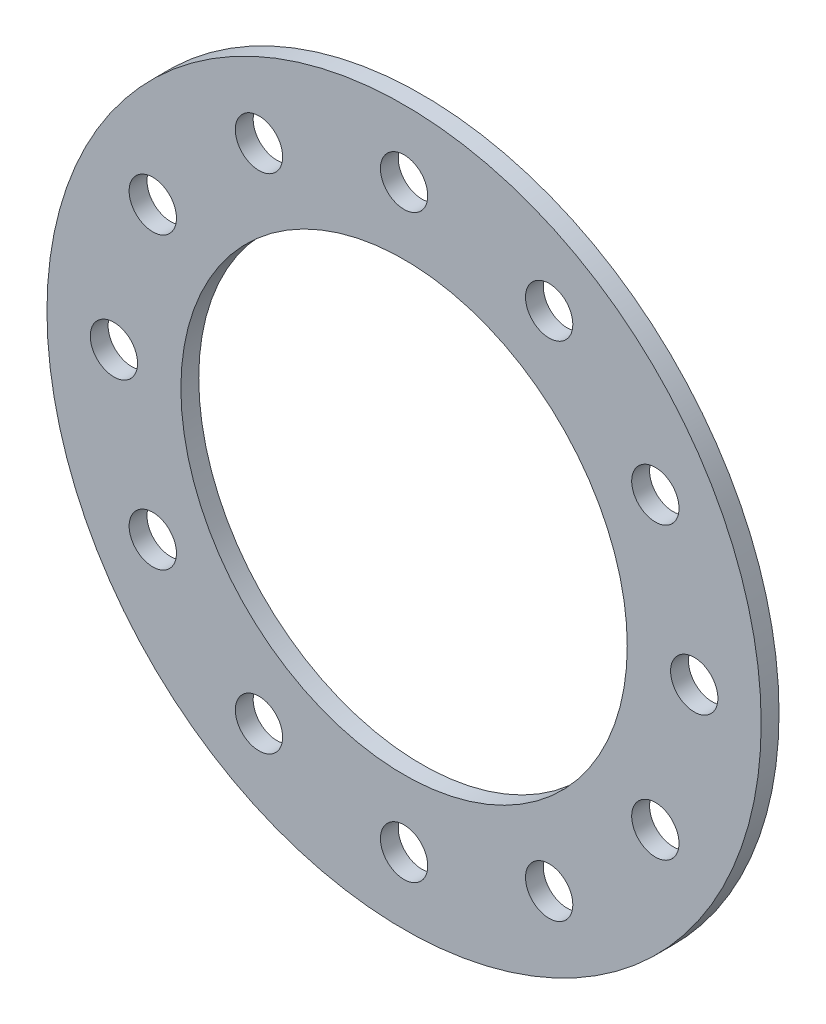
ISO-10303-21;
HEADER;
FILE_DESCRIPTION(('STEP AP214'),'2;1');
FILE_NAME('part.step','',(''),(''),'','','');
FILE_SCHEMA(('AUTOMOTIVE_DESIGN { 1 0 10303 214 1 1 1 1 }'));
ENDSEC;
DATA;
#1=APPLICATION_CONTEXT('core data for automotive mechanical design processes');
#2=APPLICATION_PROTOCOL_DEFINITION('international standard','automotive_design',2000,#1);
#3=PRODUCT_CONTEXT('',#1,'mechanical');
#4=PRODUCT('Part','Part','',(#3));
#5=PRODUCT_RELATED_PRODUCT_CATEGORY('part','',(#4));
#6=PRODUCT_DEFINITION_FORMATION('','',#4);
#7=PRODUCT_DEFINITION_CONTEXT('part definition',#1,'design');
#8=PRODUCT_DEFINITION('design','',#6,#7);
#9=PRODUCT_DEFINITION_SHAPE('','',#8);
#10=(LENGTH_UNIT() NAMED_UNIT(*) SI_UNIT(.MILLI.,.METRE.));
#11=(NAMED_UNIT(*) PLANE_ANGLE_UNIT() SI_UNIT($,.RADIAN.));
#12=(NAMED_UNIT(*) SI_UNIT($,.STERADIAN.) SOLID_ANGLE_UNIT());
#13=UNCERTAINTY_MEASURE_WITH_UNIT(LENGTH_MEASURE(1.E-05),#10,'distance_accuracy_value','');
#14=(GEOMETRIC_REPRESENTATION_CONTEXT(3) GLOBAL_UNCERTAINTY_ASSIGNED_CONTEXT((#13)) GLOBAL_UNIT_ASSIGNED_CONTEXT((#10,
#11,#12)) REPRESENTATION_CONTEXT('',''));
#15=CARTESIAN_POINT('',(0.,0.,0.));
#16=DIRECTION('',(0.,0.,1.));
#17=DIRECTION('',(1.,0.,0.));
#18=AXIS2_PLACEMENT_3D('',#15,#16,#17);
#19=CARTESIAN_POINT('',(0.,0.,2.));
#20=DIRECTION('',(0.,0.,1.));
#21=DIRECTION('',(1.,0.,0.));
#22=AXIS2_PLACEMENT_3D('',#19,#20,#21);
#23=PLANE('',#22);
#24=CARTESIAN_POINT('',(16.2499999999996,28.1458256229945,2.));
#25=DIRECTION('',(0.,0.,1.));
#26=DIRECTION('',(1.,0.,0.));
#27=AXIS2_PLACEMENT_3D('',#24,#25,#26);
#28=CIRCLE('',#27,2.65);
#29=CARTESIAN_POINT('',(18.8999999999996,28.1458256229945,2.));
#30=VERTEX_POINT('',#29);
#31=EDGE_CURVE('E119',#30,#30,#28,.T.);
#32=ORIENTED_EDGE('',*,*,#31,.F.);
#33=EDGE_LOOP('',(#32));
#34=FACE_BOUND('',#33,.T.);
#35=CARTESIAN_POINT('',(28.1458256229941,16.2500000000003,2.));
#36=DIRECTION('',(0.,0.,1.));
#37=DIRECTION('',(1.,0.,0.));
#38=AXIS2_PLACEMENT_3D('',#35,#36,#37);
#39=CIRCLE('',#38,2.65);
#40=CARTESIAN_POINT('',(30.7958256229941,16.2500000000003,2.));
#41=VERTEX_POINT('',#40);
#42=EDGE_CURVE('E113',#41,#41,#39,.T.);
#43=ORIENTED_EDGE('',*,*,#42,.F.);
#44=EDGE_LOOP('',(#43));
#45=FACE_BOUND('',#44,.T.);
#46=CARTESIAN_POINT('',(32.5,3.40419430537206E-13,2.));
#47=DIRECTION('',(0.,0.,1.));
#48=DIRECTION('',(1.,0.,0.));
#49=AXIS2_PLACEMENT_3D('',#46,#47,#48);
#50=CIRCLE('',#49,2.65);
#51=CARTESIAN_POINT('',(35.15,3.40419430537206E-13,2.));
#52=VERTEX_POINT('',#51);
#53=EDGE_CURVE('E107',#52,#52,#50,.T.);
#54=ORIENTED_EDGE('',*,*,#53,.F.);
#55=EDGE_LOOP('',(#54));
#56=FACE_BOUND('',#55,.T.);
#57=CARTESIAN_POINT('',(28.1458256229944,-16.2499999999997,2.));
#58=DIRECTION('',(0.,0.,1.));
#59=DIRECTION('',(1.,0.,0.));
#60=AXIS2_PLACEMENT_3D('',#57,#58,#59);
#61=CIRCLE('',#60,2.65);
#62=CARTESIAN_POINT('',(30.7958256229944,-16.2499999999997,2.));
#63=VERTEX_POINT('',#62);
#64=EDGE_CURVE('E101',#63,#63,#61,.T.);
#65=ORIENTED_EDGE('',*,*,#64,.F.);
#66=EDGE_LOOP('',(#65));
#67=FACE_BOUND('',#66,.T.);
#68=CARTESIAN_POINT('',(16.2500000000002,-28.1458256229941,2.));
#69=DIRECTION('',(0.,0.,1.));
#70=DIRECTION('',(1.,0.,0.));
#71=AXIS2_PLACEMENT_3D('',#68,#69,#70);
#72=CIRCLE('',#71,2.65);
#73=CARTESIAN_POINT('',(18.9000000000002,-28.1458256229941,2.));
#74=VERTEX_POINT('',#73);
#75=EDGE_CURVE('E95',#74,#74,#72,.T.);
#76=ORIENTED_EDGE('',*,*,#75,.F.);
#77=EDGE_LOOP('',(#76));
#78=FACE_BOUND('',#77,.T.);
#79=CARTESIAN_POINT('',(0.,-32.5,2.));
#80=DIRECTION('',(0.,0.,1.));
#81=DIRECTION('',(1.,0.,0.));
#82=AXIS2_PLACEMENT_3D('',#79,#80,#81);
#83=CIRCLE('',#82,2.65);
#84=CARTESIAN_POINT('',(2.65,-32.5,2.));
#85=VERTEX_POINT('',#84);
#86=EDGE_CURVE('E89',#85,#85,#83,.T.);
#87=ORIENTED_EDGE('',*,*,#86,.F.);
#88=EDGE_LOOP('',(#87));
#89=FACE_BOUND('',#88,.T.);
#90=CARTESIAN_POINT('',(-16.2499999999998,-28.1458256229944,2.));
#91=DIRECTION('',(0.,0.,1.));
#92=DIRECTION('',(1.,0.,0.));
#93=AXIS2_PLACEMENT_3D('',#90,#91,#92);
#94=CIRCLE('',#93,2.65);
#95=CARTESIAN_POINT('',(-13.5999999999998,-28.1458256229944,2.));
#96=VERTEX_POINT('',#95);
#97=EDGE_CURVE('E83',#96,#96,#94,.T.);
#98=ORIENTED_EDGE('',*,*,#97,.F.);
#99=EDGE_LOOP('',(#98));
#100=FACE_BOUND('',#99,.T.);
#101=CARTESIAN_POINT('',(-28.1458256229942,-16.2500000000001,2.));
#102=DIRECTION('',(0.,0.,1.));
#103=DIRECTION('',(1.,0.,0.));
#104=AXIS2_PLACEMENT_3D('',#101,#102,#103);
#105=CIRCLE('',#104,2.65);
#106=CARTESIAN_POINT('',(-25.4958256229942,-16.2500000000001,2.));
#107=VERTEX_POINT('',#106);
#108=EDGE_CURVE('E77',#107,#107,#105,.T.);
#109=ORIENTED_EDGE('',*,*,#108,.F.);
#110=EDGE_LOOP('',(#109));
#111=FACE_BOUND('',#110,.T.);
#112=CARTESIAN_POINT('',(-32.5,-1.13473143512402E-13,2.));
#113=DIRECTION('',(0.,0.,1.));
#114=DIRECTION('',(1.,0.,0.));
#115=AXIS2_PLACEMENT_3D('',#112,#113,#114);
#116=CIRCLE('',#115,2.65);
#117=CARTESIAN_POINT('',(-29.85,-1.13473143512402E-13,2.));
#118=VERTEX_POINT('',#117);
#119=EDGE_CURVE('E71',#118,#118,#116,.T.);
#120=ORIENTED_EDGE('',*,*,#119,.F.);
#121=EDGE_LOOP('',(#120));
#122=FACE_BOUND('',#121,.T.);
#123=CARTESIAN_POINT('',(-28.1458256229943,16.2499999999999,2.));
#124=DIRECTION('',(0.,0.,1.));
#125=DIRECTION('',(1.,0.,0.));
#126=AXIS2_PLACEMENT_3D('',#123,#124,#125);
#127=CIRCLE('',#126,2.65);
#128=CARTESIAN_POINT('',(-25.4958256229943,16.2499999999999,2.));
#129=VERTEX_POINT('',#128);
#130=EDGE_CURVE('E65',#129,#129,#127,.T.);
#131=ORIENTED_EDGE('',*,*,#130,.F.);
#132=EDGE_LOOP('',(#131));
#133=FACE_BOUND('',#132,.T.);
#134=CARTESIAN_POINT('',(-16.25,28.1458256229942,2.));
#135=DIRECTION('',(0.,0.,1.));
#136=DIRECTION('',(1.,0.,0.));
#137=AXIS2_PLACEMENT_3D('',#134,#135,#136);
#138=CIRCLE('',#137,2.65);
#139=CARTESIAN_POINT('',(-13.6,28.1458256229942,2.));
#140=VERTEX_POINT('',#139);
#141=EDGE_CURVE('E59',#140,#140,#138,.T.);
#142=ORIENTED_EDGE('',*,*,#141,.F.);
#143=EDGE_LOOP('',(#142));
#144=FACE_BOUND('',#143,.T.);
#145=CARTESIAN_POINT('',(0.,32.5,2.));
#146=DIRECTION('',(0.,0.,1.));
#147=DIRECTION('',(1.,0.,0.));
#148=AXIS2_PLACEMENT_3D('',#145,#146,#147);
#149=CIRCLE('',#148,2.65);
#150=CARTESIAN_POINT('',(2.65,32.5,2.));
#151=VERTEX_POINT('',#150);
#152=EDGE_CURVE('E53',#151,#151,#149,.T.);
#153=ORIENTED_EDGE('',*,*,#152,.F.);
#154=EDGE_LOOP('',(#153));
#155=FACE_BOUND('',#154,.T.);
#156=CARTESIAN_POINT('',(0.,0.,2.));
#157=DIRECTION('',(0.,0.,1.));
#158=DIRECTION('',(1.,0.,0.));
#159=AXIS2_PLACEMENT_3D('',#156,#157,#158);
#160=CIRCLE('',#159,40.);
#161=CARTESIAN_POINT('',(40.,0.,2.));
#162=VERTEX_POINT('',#161);
#163=EDGE_CURVE('E10',#162,#162,#160,.T.);
#164=ORIENTED_EDGE('',*,*,#163,.T.);
#165=EDGE_LOOP('',(#164));
#166=FACE_BOUND('',#165,.T.);
#167=CARTESIAN_POINT('',(0.,0.,2.));
#168=DIRECTION('',(0.,0.,1.));
#169=DIRECTION('',(1.,0.,0.));
#170=AXIS2_PLACEMENT_3D('',#167,#168,#169);
#171=CIRCLE('',#170,25.);
#172=CARTESIAN_POINT('',(25.,0.,2.));
#173=VERTEX_POINT('',#172);
#174=EDGE_CURVE('E43',#173,#173,#171,.T.);
#175=ORIENTED_EDGE('',*,*,#174,.F.);
#176=EDGE_LOOP('',(#175));
#177=FACE_BOUND('',#176,.T.);
#178=ADVANCED_FACE('F32',(#34,#45,#56,#67,#78,#89,#100,#111,#122,#133,#144,#155,#166,#177),#23,.T.);
#179=CARTESIAN_POINT('',(0.,0.,0.));
#180=DIRECTION('',(0.,0.,1.));
#181=DIRECTION('',(1.,0.,0.));
#182=AXIS2_PLACEMENT_3D('',#179,#180,#181);
#183=PLANE('',#182);
#184=CARTESIAN_POINT('',(16.2499999999996,28.1458256229945,0.));
#185=DIRECTION('',(0.,0.,1.));
#186=DIRECTION('',(1.,0.,0.));
#187=AXIS2_PLACEMENT_3D('',#184,#185,#186);
#188=CIRCLE('',#187,2.65);
#189=CARTESIAN_POINT('',(18.8999999999996,28.1458256229945,0.));
#190=VERTEX_POINT('',#189);
#191=EDGE_CURVE('E116',#190,#190,#188,.T.);
#192=ORIENTED_EDGE('',*,*,#191,.T.);
#193=EDGE_LOOP('',(#192));
#194=FACE_BOUND('',#193,.T.);
#195=CARTESIAN_POINT('',(28.1458256229941,16.2500000000003,0.));
#196=DIRECTION('',(0.,0.,1.));
#197=DIRECTION('',(1.,0.,0.));
#198=AXIS2_PLACEMENT_3D('',#195,#196,#197);
#199=CIRCLE('',#198,2.65);
#200=CARTESIAN_POINT('',(30.7958256229941,16.2500000000003,0.));
#201=VERTEX_POINT('',#200);
#202=EDGE_CURVE('E110',#201,#201,#199,.T.);
#203=ORIENTED_EDGE('',*,*,#202,.T.);
#204=EDGE_LOOP('',(#203));
#205=FACE_BOUND('',#204,.T.);
#206=CARTESIAN_POINT('',(32.5,3.40419430537206E-13,0.));
#207=DIRECTION('',(0.,0.,1.));
#208=DIRECTION('',(1.,0.,0.));
#209=AXIS2_PLACEMENT_3D('',#206,#207,#208);
#210=CIRCLE('',#209,2.65);
#211=CARTESIAN_POINT('',(35.15,3.40419430537206E-13,0.));
#212=VERTEX_POINT('',#211);
#213=EDGE_CURVE('E104',#212,#212,#210,.T.);
#214=ORIENTED_EDGE('',*,*,#213,.T.);
#215=EDGE_LOOP('',(#214));
#216=FACE_BOUND('',#215,.T.);
#217=CARTESIAN_POINT('',(28.1458256229944,-16.2499999999997,0.));
#218=DIRECTION('',(0.,0.,1.));
#219=DIRECTION('',(1.,0.,0.));
#220=AXIS2_PLACEMENT_3D('',#217,#218,#219);
#221=CIRCLE('',#220,2.65);
#222=CARTESIAN_POINT('',(30.7958256229944,-16.2499999999997,0.));
#223=VERTEX_POINT('',#222);
#224=EDGE_CURVE('E98',#223,#223,#221,.T.);
#225=ORIENTED_EDGE('',*,*,#224,.T.);
#226=EDGE_LOOP('',(#225));
#227=FACE_BOUND('',#226,.T.);
#228=CARTESIAN_POINT('',(16.2500000000002,-28.1458256229941,0.));
#229=DIRECTION('',(0.,0.,1.));
#230=DIRECTION('',(1.,0.,0.));
#231=AXIS2_PLACEMENT_3D('',#228,#229,#230);
#232=CIRCLE('',#231,2.65);
#233=CARTESIAN_POINT('',(18.9000000000002,-28.1458256229941,0.));
#234=VERTEX_POINT('',#233);
#235=EDGE_CURVE('E92',#234,#234,#232,.T.);
#236=ORIENTED_EDGE('',*,*,#235,.T.);
#237=EDGE_LOOP('',(#236));
#238=FACE_BOUND('',#237,.T.);
#239=CARTESIAN_POINT('',(0.,-32.5,0.));
#240=DIRECTION('',(0.,0.,1.));
#241=DIRECTION('',(1.,0.,0.));
#242=AXIS2_PLACEMENT_3D('',#239,#240,#241);
#243=CIRCLE('',#242,2.65);
#244=CARTESIAN_POINT('',(2.65,-32.5,0.));
#245=VERTEX_POINT('',#244);
#246=EDGE_CURVE('E86',#245,#245,#243,.T.);
#247=ORIENTED_EDGE('',*,*,#246,.T.);
#248=EDGE_LOOP('',(#247));
#249=FACE_BOUND('',#248,.T.);
#250=CARTESIAN_POINT('',(-16.2499999999998,-28.1458256229944,0.));
#251=DIRECTION('',(0.,0.,1.));
#252=DIRECTION('',(1.,0.,0.));
#253=AXIS2_PLACEMENT_3D('',#250,#251,#252);
#254=CIRCLE('',#253,2.65);
#255=CARTESIAN_POINT('',(-13.5999999999998,-28.1458256229944,0.));
#256=VERTEX_POINT('',#255);
#257=EDGE_CURVE('E80',#256,#256,#254,.T.);
#258=ORIENTED_EDGE('',*,*,#257,.T.);
#259=EDGE_LOOP('',(#258));
#260=FACE_BOUND('',#259,.T.);
#261=CARTESIAN_POINT('',(-28.1458256229942,-16.2500000000001,0.));
#262=DIRECTION('',(0.,0.,1.));
#263=DIRECTION('',(1.,0.,0.));
#264=AXIS2_PLACEMENT_3D('',#261,#262,#263);
#265=CIRCLE('',#264,2.65);
#266=CARTESIAN_POINT('',(-25.4958256229942,-16.2500000000001,0.));
#267=VERTEX_POINT('',#266);
#268=EDGE_CURVE('E74',#267,#267,#265,.T.);
#269=ORIENTED_EDGE('',*,*,#268,.T.);
#270=EDGE_LOOP('',(#269));
#271=FACE_BOUND('',#270,.T.);
#272=CARTESIAN_POINT('',(-32.5,-1.13473143512402E-13,0.));
#273=DIRECTION('',(0.,0.,1.));
#274=DIRECTION('',(1.,0.,0.));
#275=AXIS2_PLACEMENT_3D('',#272,#273,#274);
#276=CIRCLE('',#275,2.65);
#277=CARTESIAN_POINT('',(-29.85,-1.13473143512402E-13,0.));
#278=VERTEX_POINT('',#277);
#279=EDGE_CURVE('E68',#278,#278,#276,.T.);
#280=ORIENTED_EDGE('',*,*,#279,.T.);
#281=EDGE_LOOP('',(#280));
#282=FACE_BOUND('',#281,.T.);
#283=CARTESIAN_POINT('',(-28.1458256229943,16.2499999999999,0.));
#284=DIRECTION('',(0.,0.,1.));
#285=DIRECTION('',(1.,0.,0.));
#286=AXIS2_PLACEMENT_3D('',#283,#284,#285);
#287=CIRCLE('',#286,2.65);
#288=CARTESIAN_POINT('',(-25.4958256229943,16.2499999999999,0.));
#289=VERTEX_POINT('',#288);
#290=EDGE_CURVE('E62',#289,#289,#287,.T.);
#291=ORIENTED_EDGE('',*,*,#290,.T.);
#292=EDGE_LOOP('',(#291));
#293=FACE_BOUND('',#292,.T.);
#294=CARTESIAN_POINT('',(-16.25,28.1458256229942,0.));
#295=DIRECTION('',(0.,0.,1.));
#296=DIRECTION('',(1.,0.,0.));
#297=AXIS2_PLACEMENT_3D('',#294,#295,#296);
#298=CIRCLE('',#297,2.65);
#299=CARTESIAN_POINT('',(-13.6,28.1458256229942,0.));
#300=VERTEX_POINT('',#299);
#301=EDGE_CURVE('E56',#300,#300,#298,.T.);
#302=ORIENTED_EDGE('',*,*,#301,.T.);
#303=EDGE_LOOP('',(#302));
#304=FACE_BOUND('',#303,.T.);
#305=CARTESIAN_POINT('',(0.,32.5,0.));
#306=DIRECTION('',(0.,0.,1.));
#307=DIRECTION('',(1.,0.,0.));
#308=AXIS2_PLACEMENT_3D('',#305,#306,#307);
#309=CIRCLE('',#308,2.65);
#310=CARTESIAN_POINT('',(2.65,32.5,0.));
#311=VERTEX_POINT('',#310);
#312=EDGE_CURVE('E48',#311,#311,#309,.T.);
#313=ORIENTED_EDGE('',*,*,#312,.T.);
#314=EDGE_LOOP('',(#313));
#315=FACE_BOUND('',#314,.T.);
#316=CARTESIAN_POINT('',(0.,0.,0.));
#317=DIRECTION('',(0.,0.,1.));
#318=DIRECTION('',(1.,0.,0.));
#319=AXIS2_PLACEMENT_3D('',#316,#317,#318);
#320=CIRCLE('',#319,40.);
#321=CARTESIAN_POINT('',(40.,0.,0.));
#322=VERTEX_POINT('',#321);
#323=EDGE_CURVE('E36',#322,#322,#320,.T.);
#324=ORIENTED_EDGE('',*,*,#323,.F.);
#325=EDGE_LOOP('',(#324));
#326=FACE_BOUND('',#325,.T.);
#327=CARTESIAN_POINT('',(0.,0.,0.));
#328=DIRECTION('',(0.,0.,1.));
#329=DIRECTION('',(1.,0.,0.));
#330=AXIS2_PLACEMENT_3D('',#327,#328,#329);
#331=CIRCLE('',#330,25.);
#332=CARTESIAN_POINT('',(25.,0.,0.));
#333=VERTEX_POINT('',#332);
#334=EDGE_CURVE('E45',#333,#333,#331,.T.);
#335=ORIENTED_EDGE('',*,*,#334,.T.);
#336=EDGE_LOOP('',(#335));
#337=FACE_BOUND('',#336,.T.);
#338=ADVANCED_FACE('F127',(#194,#205,#216,#227,#238,#249,#260,#271,#282,#293,#304,#315,#326,
#337),#183,.F.);
#339=CARTESIAN_POINT('',(0.,0.,2.));
#340=DIRECTION('',(0.,0.,-1.));
#341=DIRECTION('',(-1.,0.,0.));
#342=AXIS2_PLACEMENT_3D('',#339,#340,#341);
#343=CYLINDRICAL_SURFACE('',#342,40.);
#344=ORIENTED_EDGE('',*,*,#163,.F.);
#345=EDGE_LOOP('',(#344));
#346=FACE_BOUND('',#345,.T.);
#347=ORIENTED_EDGE('',*,*,#323,.T.);
#348=EDGE_LOOP('',(#347));
#349=FACE_BOUND('',#348,.T.);
#350=ADVANCED_FACE('F34',(#346,#349),#343,.T.);
#351=CARTESIAN_POINT('',(0.,0.,2.));
#352=DIRECTION('',(0.,0.,-1.));
#353=DIRECTION('',(-1.,0.,0.));
#354=AXIS2_PLACEMENT_3D('',#351,#352,#353);
#355=CYLINDRICAL_SURFACE('',#354,25.);
#356=ORIENTED_EDGE('',*,*,#174,.T.);
#357=EDGE_LOOP('',(#356));
#358=FACE_BOUND('',#357,.T.);
#359=ORIENTED_EDGE('',*,*,#334,.F.);
#360=EDGE_LOOP('',(#359));
#361=FACE_BOUND('',#360,.T.);
#362=ADVANCED_FACE('F153',(#358,#361),#355,.F.);
#363=CARTESIAN_POINT('',(0.,32.5,2.));
#364=DIRECTION('',(0.,0.,1.));
#365=DIRECTION('',(1.,0.,0.));
#366=AXIS2_PLACEMENT_3D('',#363,#364,#365);
#367=CYLINDRICAL_SURFACE('',#366,2.65);
#368=ORIENTED_EDGE('',*,*,#312,.F.);
#369=EDGE_LOOP('',(#368));
#370=FACE_BOUND('',#369,.T.);
#371=ORIENTED_EDGE('',*,*,#152,.T.);
#372=EDGE_LOOP('',(#371));
#373=FACE_BOUND('',#372,.T.);
#374=ADVANCED_FACE('F156',(#370,#373),#367,.F.);
#375=CARTESIAN_POINT('',(-16.25,28.1458256229942,2.));
#376=DIRECTION('',(0.,0.,1.));
#377=DIRECTION('',(1.,0.,0.));
#378=AXIS2_PLACEMENT_3D('',#375,#376,#377);
#379=CYLINDRICAL_SURFACE('',#378,2.65);
#380=ORIENTED_EDGE('',*,*,#301,.F.);
#381=EDGE_LOOP('',(#380));
#382=FACE_BOUND('',#381,.T.);
#383=ORIENTED_EDGE('',*,*,#141,.T.);
#384=EDGE_LOOP('',(#383));
#385=FACE_BOUND('',#384,.T.);
#386=ADVANCED_FACE('F170',(#382,#385),#379,.F.);
#387=CARTESIAN_POINT('',(-28.1458256229943,16.2499999999999,2.));
#388=DIRECTION('',(0.,0.,1.));
#389=DIRECTION('',(1.,0.,0.));
#390=AXIS2_PLACEMENT_3D('',#387,#388,#389);
#391=CYLINDRICAL_SURFACE('',#390,2.65);
#392=ORIENTED_EDGE('',*,*,#290,.F.);
#393=EDGE_LOOP('',(#392));
#394=FACE_BOUND('',#393,.T.);
#395=ORIENTED_EDGE('',*,*,#130,.T.);
#396=EDGE_LOOP('',(#395));
#397=FACE_BOUND('',#396,.T.);
#398=ADVANCED_FACE('F174',(#394,#397),#391,.F.);
#399=CARTESIAN_POINT('',(-32.5,-1.13473143512402E-13,2.));
#400=DIRECTION('',(0.,0.,1.));
#401=DIRECTION('',(1.,0.,0.));
#402=AXIS2_PLACEMENT_3D('',#399,#400,#401);
#403=CYLINDRICAL_SURFACE('',#402,2.65);
#404=ORIENTED_EDGE('',*,*,#279,.F.);
#405=EDGE_LOOP('',(#404));
#406=FACE_BOUND('',#405,.T.);
#407=ORIENTED_EDGE('',*,*,#119,.T.);
#408=EDGE_LOOP('',(#407));
#409=FACE_BOUND('',#408,.T.);
#410=ADVANCED_FACE('F178',(#406,#409),#403,.F.);
#411=CARTESIAN_POINT('',(-28.1458256229942,-16.2500000000001,2.));
#412=DIRECTION('',(0.,0.,1.));
#413=DIRECTION('',(1.,0.,0.));
#414=AXIS2_PLACEMENT_3D('',#411,#412,#413);
#415=CYLINDRICAL_SURFACE('',#414,2.65);
#416=ORIENTED_EDGE('',*,*,#268,.F.);
#417=EDGE_LOOP('',(#416));
#418=FACE_BOUND('',#417,.T.);
#419=ORIENTED_EDGE('',*,*,#108,.T.);
#420=EDGE_LOOP('',(#419));
#421=FACE_BOUND('',#420,.T.);
#422=ADVANCED_FACE('F182',(#418,#421),#415,.F.);
#423=CARTESIAN_POINT('',(-16.2499999999998,-28.1458256229944,2.));
#424=DIRECTION('',(0.,0.,1.));
#425=DIRECTION('',(1.,0.,0.));
#426=AXIS2_PLACEMENT_3D('',#423,#424,#425);
#427=CYLINDRICAL_SURFACE('',#426,2.65);
#428=ORIENTED_EDGE('',*,*,#257,.F.);
#429=EDGE_LOOP('',(#428));
#430=FACE_BOUND('',#429,.T.);
#431=ORIENTED_EDGE('',*,*,#97,.T.);
#432=EDGE_LOOP('',(#431));
#433=FACE_BOUND('',#432,.T.);
#434=ADVANCED_FACE('F186',(#430,#433),#427,.F.);
#435=CARTESIAN_POINT('',(0.,-32.5,2.));
#436=DIRECTION('',(0.,0.,1.));
#437=DIRECTION('',(1.,0.,0.));
#438=AXIS2_PLACEMENT_3D('',#435,#436,#437);
#439=CYLINDRICAL_SURFACE('',#438,2.65);
#440=ORIENTED_EDGE('',*,*,#246,.F.);
#441=EDGE_LOOP('',(#440));
#442=FACE_BOUND('',#441,.T.);
#443=ORIENTED_EDGE('',*,*,#86,.T.);
#444=EDGE_LOOP('',(#443));
#445=FACE_BOUND('',#444,.T.);
#446=ADVANCED_FACE('F190',(#442,#445),#439,.F.);
#447=CARTESIAN_POINT('',(16.2500000000002,-28.1458256229941,2.));
#448=DIRECTION('',(0.,0.,1.));
#449=DIRECTION('',(1.,0.,0.));
#450=AXIS2_PLACEMENT_3D('',#447,#448,#449);
#451=CYLINDRICAL_SURFACE('',#450,2.65);
#452=ORIENTED_EDGE('',*,*,#235,.F.);
#453=EDGE_LOOP('',(#452));
#454=FACE_BOUND('',#453,.T.);
#455=ORIENTED_EDGE('',*,*,#75,.T.);
#456=EDGE_LOOP('',(#455));
#457=FACE_BOUND('',#456,.T.);
#458=ADVANCED_FACE('F194',(#454,#457),#451,.F.);
#459=CARTESIAN_POINT('',(28.1458256229944,-16.2499999999997,2.));
#460=DIRECTION('',(0.,0.,1.));
#461=DIRECTION('',(1.,0.,0.));
#462=AXIS2_PLACEMENT_3D('',#459,#460,#461);
#463=CYLINDRICAL_SURFACE('',#462,2.65);
#464=ORIENTED_EDGE('',*,*,#224,.F.);
#465=EDGE_LOOP('',(#464));
#466=FACE_BOUND('',#465,.T.);
#467=ORIENTED_EDGE('',*,*,#64,.T.);
#468=EDGE_LOOP('',(#467));
#469=FACE_BOUND('',#468,.T.);
#470=ADVANCED_FACE('F198',(#466,#469),#463,.F.);
#471=CARTESIAN_POINT('',(32.5,3.40419430537206E-13,2.));
#472=DIRECTION('',(0.,0.,1.));
#473=DIRECTION('',(1.,0.,0.));
#474=AXIS2_PLACEMENT_3D('',#471,#472,#473);
#475=CYLINDRICAL_SURFACE('',#474,2.65);
#476=ORIENTED_EDGE('',*,*,#213,.F.);
#477=EDGE_LOOP('',(#476));
#478=FACE_BOUND('',#477,.T.);
#479=ORIENTED_EDGE('',*,*,#53,.T.);
#480=EDGE_LOOP('',(#479));
#481=FACE_BOUND('',#480,.T.);
#482=ADVANCED_FACE('F202',(#478,#481),#475,.F.);
#483=CARTESIAN_POINT('',(28.1458256229941,16.2500000000003,2.));
#484=DIRECTION('',(0.,0.,1.));
#485=DIRECTION('',(1.,0.,0.));
#486=AXIS2_PLACEMENT_3D('',#483,#484,#485);
#487=CYLINDRICAL_SURFACE('',#486,2.65);
#488=ORIENTED_EDGE('',*,*,#202,.F.);
#489=EDGE_LOOP('',(#488));
#490=FACE_BOUND('',#489,.T.);
#491=ORIENTED_EDGE('',*,*,#42,.T.);
#492=EDGE_LOOP('',(#491));
#493=FACE_BOUND('',#492,.T.);
#494=ADVANCED_FACE('F206',(#490,#493),#487,.F.);
#495=CARTESIAN_POINT('',(16.2499999999996,28.1458256229945,2.));
#496=DIRECTION('',(0.,0.,1.));
#497=DIRECTION('',(1.,0.,0.));
#498=AXIS2_PLACEMENT_3D('',#495,#496,#497);
#499=CYLINDRICAL_SURFACE('',#498,2.65);
#500=ORIENTED_EDGE('',*,*,#191,.F.);
#501=EDGE_LOOP('',(#500));
#502=FACE_BOUND('',#501,.T.);
#503=ORIENTED_EDGE('',*,*,#31,.T.);
#504=EDGE_LOOP('',(#503));
#505=FACE_BOUND('',#504,.T.);
#506=ADVANCED_FACE('F123',(#502,#505),#499,.F.);
#507=CLOSED_SHELL('',(#178,#338,#350,#362,#374,#386,#398,#410,#422,#434,#446,#458,#470,#482,
#494,#506));
#508=MANIFOLD_SOLID_BREP('B2',#507);
#509=ADVANCED_BREP_SHAPE_REPRESENTATION('',(#18,#508),#14);
#510=SHAPE_DEFINITION_REPRESENTATION(#9,#509);
ENDSEC;
END-ISO-10303-21;
